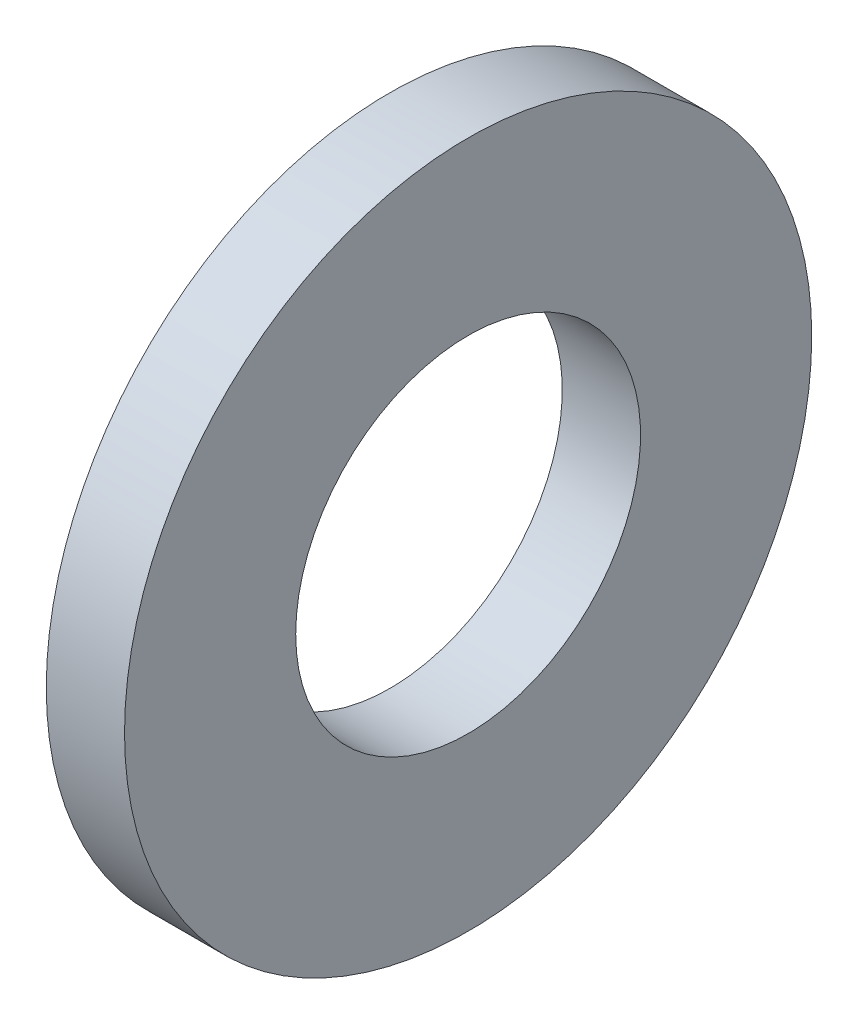
ISO-10303-21;
HEADER;
FILE_DESCRIPTION(('STEP AP214'),'2;1');
FILE_NAME('part.step','',(''),(''),'','','');
FILE_SCHEMA(('AUTOMOTIVE_DESIGN { 1 0 10303 214 1 1 1 1 }'));
ENDSEC;
DATA;
#1=APPLICATION_CONTEXT('core data for automotive mechanical design processes');
#2=APPLICATION_PROTOCOL_DEFINITION('international standard','automotive_design',2000,#1);
#3=PRODUCT_CONTEXT('',#1,'mechanical');
#4=PRODUCT('Part','Part','',(#3));
#5=PRODUCT_RELATED_PRODUCT_CATEGORY('part','',(#4));
#6=PRODUCT_DEFINITION_FORMATION('','',#4);
#7=PRODUCT_DEFINITION_CONTEXT('part definition',#1,'design');
#8=PRODUCT_DEFINITION('design','',#6,#7);
#9=PRODUCT_DEFINITION_SHAPE('','',#8);
#10=(LENGTH_UNIT() NAMED_UNIT(*) SI_UNIT(.MILLI.,.METRE.));
#11=(NAMED_UNIT(*) PLANE_ANGLE_UNIT() SI_UNIT($,.RADIAN.));
#12=(NAMED_UNIT(*) SI_UNIT($,.STERADIAN.) SOLID_ANGLE_UNIT());
#13=UNCERTAINTY_MEASURE_WITH_UNIT(LENGTH_MEASURE(1.E-05),#10,'distance_accuracy_value','');
#14=(GEOMETRIC_REPRESENTATION_CONTEXT(3) GLOBAL_UNCERTAINTY_ASSIGNED_CONTEXT((#13)) GLOBAL_UNIT_ASSIGNED_CONTEXT((#10,
#11,#12)) REPRESENTATION_CONTEXT('',''));
#15=CARTESIAN_POINT('',(0.,0.,0.));
#16=DIRECTION('',(0.,0.,1.));
#17=DIRECTION('',(1.,0.,0.));
#18=AXIS2_PLACEMENT_3D('',#15,#16,#17);
#19=CARTESIAN_POINT('',(-34.9249999999999,0.,0.));
#20=DIRECTION('',(-1.,0.,0.));
#21=DIRECTION('',(0.,0.,1.));
#22=AXIS2_PLACEMENT_3D('',#19,#20,#21);
#23=CYLINDRICAL_SURFACE('',#22,1.7907);
#24=CARTESIAN_POINT('',(0.,0.,0.));
#25=DIRECTION('',(-1.,0.,0.));
#26=DIRECTION('',(0.,0.,1.));
#27=AXIS2_PLACEMENT_3D('',#24,#25,#26);
#28=CIRCLE('',#27,1.7907);
#29=CARTESIAN_POINT('',(0.,0.,1.7907));
#30=VERTEX_POINT('',#29);
#31=EDGE_CURVE('E10',#30,#30,#28,.T.);
#32=ORIENTED_EDGE('',*,*,#31,.F.);
#33=EDGE_LOOP('',(#32));
#34=FACE_BOUND('',#33,.T.);
#35=CARTESIAN_POINT('',(-0.812800000000002,0.,0.));
#36=DIRECTION('',(-1.,0.,0.));
#37=DIRECTION('',(0.,0.,1.));
#38=AXIS2_PLACEMENT_3D('',#35,#36,#37);
#39=CIRCLE('',#38,1.7907);
#40=CARTESIAN_POINT('',(-0.812800000000002,0.,1.7907));
#41=VERTEX_POINT('',#40);
#42=EDGE_CURVE('E55',#41,#41,#39,.T.);
#43=ORIENTED_EDGE('',*,*,#42,.T.);
#44=EDGE_LOOP('',(#43));
#45=FACE_BOUND('',#44,.T.);
#46=ADVANCED_FACE('F41',(#34,#45),#23,.F.);
#47=CARTESIAN_POINT('',(0.,1.7907,0.));
#48=DIRECTION('',(-1.,0.,0.));
#49=DIRECTION('',(0.,0.,1.));
#50=AXIS2_PLACEMENT_3D('',#47,#48,#49);
#51=PLANE('',#50);
#52=CARTESIAN_POINT('',(0.,0.,0.));
#53=DIRECTION('',(-1.,0.,0.));
#54=DIRECTION('',(0.,0.,1.));
#55=AXIS2_PLACEMENT_3D('',#52,#53,#54);
#56=CIRCLE('',#55,3.5687);
#57=CARTESIAN_POINT('',(0.,0.,3.5687));
#58=VERTEX_POINT('',#57);
#59=EDGE_CURVE('E47',#58,#58,#56,.T.);
#60=ORIENTED_EDGE('',*,*,#59,.F.);
#61=EDGE_LOOP('',(#60));
#62=FACE_BOUND('',#61,.T.);
#63=ORIENTED_EDGE('',*,*,#31,.T.);
#64=EDGE_LOOP('',(#63));
#65=FACE_BOUND('',#64,.T.);
#66=ADVANCED_FACE('F70',(#62,#65),#51,.F.);
#67=CARTESIAN_POINT('',(-34.9249999999999,0.,0.));
#68=DIRECTION('',(-1.,0.,0.));
#69=DIRECTION('',(0.,0.,1.));
#70=AXIS2_PLACEMENT_3D('',#67,#68,#69);
#71=CYLINDRICAL_SURFACE('',#70,3.5687);
#72=CARTESIAN_POINT('',(-0.812800000000002,0.,0.));
#73=DIRECTION('',(-1.,0.,0.));
#74=DIRECTION('',(0.,0.,1.));
#75=AXIS2_PLACEMENT_3D('',#72,#73,#74);
#76=CIRCLE('',#75,3.5687);
#77=CARTESIAN_POINT('',(-0.812800000000002,0.,3.5687));
#78=VERTEX_POINT('',#77);
#79=EDGE_CURVE('E51',#78,#78,#76,.T.);
#80=ORIENTED_EDGE('',*,*,#79,.F.);
#81=EDGE_LOOP('',(#80));
#82=FACE_BOUND('',#81,.T.);
#83=ORIENTED_EDGE('',*,*,#59,.T.);
#84=EDGE_LOOP('',(#83));
#85=FACE_BOUND('',#84,.T.);
#86=ADVANCED_FACE('F65',(#82,#85),#71,.T.);
#87=CARTESIAN_POINT('',(-0.812800000000001,3.5687,0.));
#88=DIRECTION('',(1.,0.,0.));
#89=DIRECTION('',(0.,0.,-1.));
#90=AXIS2_PLACEMENT_3D('',#87,#88,#89);
#91=PLANE('',#90);
#92=ORIENTED_EDGE('',*,*,#42,.F.);
#93=EDGE_LOOP('',(#92));
#94=FACE_BOUND('',#93,.T.);
#95=ORIENTED_EDGE('',*,*,#79,.T.);
#96=EDGE_LOOP('',(#95));
#97=FACE_BOUND('',#96,.T.);
#98=ADVANCED_FACE('F62',(#94,#97),#91,.F.);
#99=CLOSED_SHELL('',(#46,#66,#86,#98));
#100=MANIFOLD_SOLID_BREP('B2',#99);
#101=ADVANCED_BREP_SHAPE_REPRESENTATION('',(#18,#100),#14);
#102=SHAPE_DEFINITION_REPRESENTATION(#9,#101);
ENDSEC;
END-ISO-10303-21;
